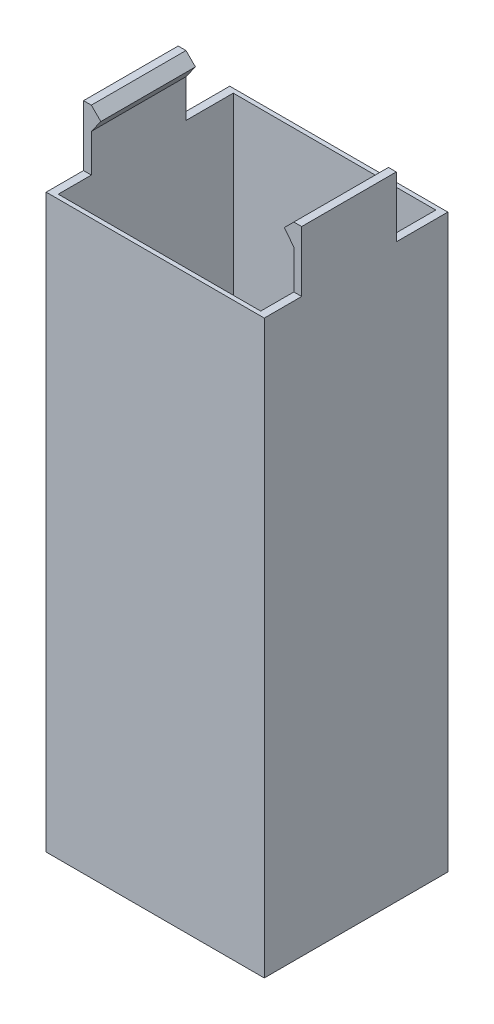
ISO-10303-21;
HEADER;
FILE_DESCRIPTION(('STEP AP214'),'2;1');
FILE_NAME('part.step','',(''),(''),'','','');
FILE_SCHEMA(('AUTOMOTIVE_DESIGN { 1 0 10303 214 1 1 1 1 }'));
ENDSEC;
DATA;
#1=APPLICATION_CONTEXT('core data for automotive mechanical design processes');
#2=APPLICATION_PROTOCOL_DEFINITION('international standard','automotive_design',2000,#1);
#3=PRODUCT_CONTEXT('',#1,'mechanical');
#4=PRODUCT('Part','Part','',(#3));
#5=PRODUCT_RELATED_PRODUCT_CATEGORY('part','',(#4));
#6=PRODUCT_DEFINITION_FORMATION('','',#4);
#7=PRODUCT_DEFINITION_CONTEXT('part definition',#1,'design');
#8=PRODUCT_DEFINITION('design','',#6,#7);
#9=PRODUCT_DEFINITION_SHAPE('','',#8);
#10=(LENGTH_UNIT() NAMED_UNIT(*) SI_UNIT(.MILLI.,.METRE.));
#11=(NAMED_UNIT(*) PLANE_ANGLE_UNIT() SI_UNIT($,.RADIAN.));
#12=(NAMED_UNIT(*) SI_UNIT($,.STERADIAN.) SOLID_ANGLE_UNIT());
#13=UNCERTAINTY_MEASURE_WITH_UNIT(LENGTH_MEASURE(1.E-05),#10,'distance_accuracy_value','');
#14=(GEOMETRIC_REPRESENTATION_CONTEXT(3) GLOBAL_UNCERTAINTY_ASSIGNED_CONTEXT((#13)) GLOBAL_UNIT_ASSIGNED_CONTEXT((#10,
#11,#12)) REPRESENTATION_CONTEXT('',''));
#15=CARTESIAN_POINT('',(0.,0.,0.));
#16=DIRECTION('',(0.,0.,1.));
#17=DIRECTION('',(1.,0.,0.));
#18=AXIS2_PLACEMENT_3D('',#15,#16,#17);
#19=CARTESIAN_POINT('',(0.,120.,0.));
#20=DIRECTION('',(0.,1.,0.));
#21=DIRECTION('',(0.,0.,1.));
#22=AXIS2_PLACEMENT_3D('',#19,#20,#21);
#23=PLANE('',#22);
#24=DIRECTION('',(0.,0.,-1.));
#25=VECTOR('',#24,1.);
#26=CARTESIAN_POINT('',(23.05,120.,-19.4));
#27=LINE('',#26,#25);
#28=CARTESIAN_POINT('',(23.05,120.,19.4));
#29=VERTEX_POINT('',#28);
#30=CARTESIAN_POINT('',(23.05,120.,11.5));
#31=VERTEX_POINT('',#30);
#32=EDGE_CURVE('E183',#29,#31,#27,.T.);
#33=ORIENTED_EDGE('',*,*,#32,.T.);
#34=DIRECTION('',(1.,0.,0.));
#35=VECTOR('',#34,1.);
#36=CARTESIAN_POINT('',(21.4,120.,11.5));
#37=LINE('',#36,#35);
#38=CARTESIAN_POINT('',(21.4,120.,11.5));
#39=VERTEX_POINT('',#38);
#40=EDGE_CURVE('E226',#39,#31,#37,.T.);
#41=ORIENTED_EDGE('',*,*,#40,.F.);
#42=DIRECTION('',(0.,0.,-1.));
#43=VECTOR('',#42,1.);
#44=CARTESIAN_POINT('',(21.4,120.,-18.5));
#45=LINE('',#44,#43);
#46=CARTESIAN_POINT('',(21.4,120.,18.5));
#47=VERTEX_POINT('',#46);
#48=EDGE_CURVE('E289',#47,#39,#45,.T.);
#49=ORIENTED_EDGE('',*,*,#48,.F.);
#50=DIRECTION('',(1.,0.,0.));
#51=VECTOR('',#50,1.);
#52=CARTESIAN_POINT('',(21.4,120.,18.5));
#53=LINE('',#52,#51);
#54=CARTESIAN_POINT('',(-21.4,120.,18.5));
#55=VERTEX_POINT('',#54);
#56=EDGE_CURVE('E285',#55,#47,#53,.T.);
#57=ORIENTED_EDGE('',*,*,#56,.F.);
#58=DIRECTION('',(0.,0.,1.));
#59=VECTOR('',#58,1.);
#60=CARTESIAN_POINT('',(-21.4,120.,-18.5));
#61=LINE('',#60,#59);
#62=CARTESIAN_POINT('',(-21.4,120.,11.5));
#63=VERTEX_POINT('',#62);
#64=EDGE_CURVE('E286',#63,#55,#61,.T.);
#65=ORIENTED_EDGE('',*,*,#64,.F.);
#66=DIRECTION('',(1.,0.,0.));
#67=VECTOR('',#66,1.);
#68=CARTESIAN_POINT('',(-21.4,120.,11.5));
#69=LINE('',#68,#67);
#70=CARTESIAN_POINT('',(-23.05,120.,11.5));
#71=VERTEX_POINT('',#70);
#72=EDGE_CURVE('E256',#71,#63,#69,.T.);
#73=ORIENTED_EDGE('',*,*,#72,.F.);
#74=DIRECTION('',(0.,0.,1.));
#75=VECTOR('',#74,1.);
#76=CARTESIAN_POINT('',(-23.05,120.,-19.4));
#77=LINE('',#76,#75);
#78=CARTESIAN_POINT('',(-23.05,120.,19.4));
#79=VERTEX_POINT('',#78);
#80=EDGE_CURVE('E318',#71,#79,#77,.T.);
#81=ORIENTED_EDGE('',*,*,#80,.T.);
#82=DIRECTION('',(1.,0.,0.));
#83=VECTOR('',#82,1.);
#84=CARTESIAN_POINT('',(-23.05,120.,19.4));
#85=LINE('',#84,#83);
#86=EDGE_CURVE('E187',#79,#29,#85,.T.);
#87=ORIENTED_EDGE('',*,*,#86,.T.);
#88=EDGE_LOOP('',(#33,#41,#49,#57,#65,#73,#81,#87));
#89=FACE_BOUND('',#88,.T.);
#90=ADVANCED_FACE('F37',(#89),#23,.T.);
#91=CARTESIAN_POINT('',(21.4,120.,-8.5));
#92=VERTEX_POINT('',#91);
#93=CARTESIAN_POINT('',(21.4,120.,-18.5));
#94=VERTEX_POINT('',#93);
#95=EDGE_CURVE('E288',#92,#94,#45,.T.);
#96=ORIENTED_EDGE('',*,*,#95,.F.);
#97=DIRECTION('',(-1.,0.,0.));
#98=VECTOR('',#97,1.);
#99=CARTESIAN_POINT('',(21.4,120.,-8.5));
#100=LINE('',#99,#98);
#101=CARTESIAN_POINT('',(23.05,120.,-8.5));
#102=VERTEX_POINT('',#101);
#103=EDGE_CURVE('E240',#102,#92,#100,.T.);
#104=ORIENTED_EDGE('',*,*,#103,.F.);
#105=CARTESIAN_POINT('',(23.05,120.,-19.4));
#106=VERTEX_POINT('',#105);
#107=EDGE_CURVE('E314',#102,#106,#27,.T.);
#108=ORIENTED_EDGE('',*,*,#107,.T.);
#109=DIRECTION('',(-1.,0.,0.));
#110=VECTOR('',#109,1.);
#111=CARTESIAN_POINT('',(-23.05,120.,-19.4));
#112=LINE('',#111,#110);
#113=CARTESIAN_POINT('',(-23.05,120.,-19.4));
#114=VERTEX_POINT('',#113);
#115=EDGE_CURVE('E316',#106,#114,#112,.T.);
#116=ORIENTED_EDGE('',*,*,#115,.T.);
#117=CARTESIAN_POINT('',(-23.05,120.,-8.49999999999999));
#118=VERTEX_POINT('',#117);
#119=EDGE_CURVE('E319',#114,#118,#77,.T.);
#120=ORIENTED_EDGE('',*,*,#119,.T.);
#121=DIRECTION('',(-1.,0.,0.));
#122=VECTOR('',#121,1.);
#123=CARTESIAN_POINT('',(-21.4,120.,-8.49999999999999));
#124=LINE('',#123,#122);
#125=CARTESIAN_POINT('',(-21.4,120.,-8.49999999999999));
#126=VERTEX_POINT('',#125);
#127=EDGE_CURVE('E261',#126,#118,#124,.T.);
#128=ORIENTED_EDGE('',*,*,#127,.F.);
#129=CARTESIAN_POINT('',(-21.4,120.,-18.5));
#130=VERTEX_POINT('',#129);
#131=EDGE_CURVE('E282',#130,#126,#61,.T.);
#132=ORIENTED_EDGE('',*,*,#131,.F.);
#133=DIRECTION('',(-1.,0.,0.));
#134=VECTOR('',#133,1.);
#135=CARTESIAN_POINT('',(21.4,120.,-18.5));
#136=LINE('',#135,#134);
#137=EDGE_CURVE('E292',#94,#130,#136,.T.);
#138=ORIENTED_EDGE('',*,*,#137,.F.);
#139=EDGE_LOOP('',(#96,#104,#108,#116,#120,#128,#132,#138));
#140=FACE_BOUND('',#139,.T.);
#141=ADVANCED_FACE('F336',(#140),#23,.T.);
#142=CARTESIAN_POINT('',(23.05,120.,-19.4));
#143=DIRECTION('',(-1.,0.,0.));
#144=DIRECTION('',(0.,0.,1.));
#145=AXIS2_PLACEMENT_3D('',#142,#143,#144);
#146=PLANE('',#145);
#147=DIRECTION('',(0.,-1.,0.));
#148=VECTOR('',#147,1.);
#149=CARTESIAN_POINT('',(23.05,120.,19.4));
#150=LINE('',#149,#148);
#151=CARTESIAN_POINT('',(23.05,-0.8,19.4));
#152=VERTEX_POINT('',#151);
#153=EDGE_CURVE('E176',#29,#152,#150,.T.);
#154=ORIENTED_EDGE('',*,*,#153,.T.);
#155=DIRECTION('',(0.,0.,1.));
#156=VECTOR('',#155,1.);
#157=CARTESIAN_POINT('',(23.05,-0.8,19.4));
#158=LINE('',#157,#156);
#159=CARTESIAN_POINT('',(23.05,-0.8,-19.4));
#160=VERTEX_POINT('',#159);
#161=EDGE_CURVE('E180',#160,#152,#158,.T.);
#162=ORIENTED_EDGE('',*,*,#161,.F.);
#163=DIRECTION('',(0.,-1.,0.));
#164=VECTOR('',#163,1.);
#165=CARTESIAN_POINT('',(23.05,120.,-19.4));
#166=LINE('',#165,#164);
#167=EDGE_CURVE('E11',#106,#160,#166,.T.);
#168=ORIENTED_EDGE('',*,*,#167,.F.);
#169=ORIENTED_EDGE('',*,*,#107,.F.);
#170=DIRECTION('',(0.,-1.,0.));
#171=VECTOR('',#170,1.);
#172=CARTESIAN_POINT('',(23.05,132.8,-8.5));
#173=LINE('',#172,#171);
#174=CARTESIAN_POINT('',(23.05,132.8,-8.5));
#175=VERTEX_POINT('',#174);
#176=EDGE_CURVE('E250',#175,#102,#173,.T.);
#177=ORIENTED_EDGE('',*,*,#176,.F.);
#178=DIRECTION('',(0.,0.,-1.));
#179=VECTOR('',#178,1.);
#180=CARTESIAN_POINT('',(23.05,132.8,11.5));
#181=LINE('',#180,#179);
#182=CARTESIAN_POINT('',(23.05,132.8,11.5));
#183=VERTEX_POINT('',#182);
#184=EDGE_CURVE('E242',#183,#175,#181,.T.);
#185=ORIENTED_EDGE('',*,*,#184,.F.);
#186=DIRECTION('',(0.,-1.,0.));
#187=VECTOR('',#186,1.);
#188=CARTESIAN_POINT('',(23.05,132.8,11.5));
#189=LINE('',#188,#187);
#190=EDGE_CURVE('E252',#183,#31,#189,.T.);
#191=ORIENTED_EDGE('',*,*,#190,.T.);
#192=ORIENTED_EDGE('',*,*,#32,.F.);
#193=EDGE_LOOP('',(#154,#162,#168,#169,#177,#185,#191,#192));
#194=FACE_BOUND('',#193,.T.);
#195=ADVANCED_FACE('F39',(#194),#146,.F.);
#196=CARTESIAN_POINT('',(-23.05,120.,-19.4));
#197=DIRECTION('',(0.,0.,1.));
#198=DIRECTION('',(1.,0.,0.));
#199=AXIS2_PLACEMENT_3D('',#196,#197,#198);
#200=PLANE('',#199);
#201=ORIENTED_EDGE('',*,*,#167,.T.);
#202=DIRECTION('',(1.,0.,0.));
#203=VECTOR('',#202,1.);
#204=CARTESIAN_POINT('',(23.05,-0.8,-19.4));
#205=LINE('',#204,#203);
#206=CARTESIAN_POINT('',(-23.05,-0.8,-19.4));
#207=VERTEX_POINT('',#206);
#208=EDGE_CURVE('E201',#207,#160,#205,.T.);
#209=ORIENTED_EDGE('',*,*,#208,.F.);
#210=DIRECTION('',(0.,-1.,0.));
#211=VECTOR('',#210,1.);
#212=CARTESIAN_POINT('',(-23.05,120.,-19.4));
#213=LINE('',#212,#211);
#214=EDGE_CURVE('E45',#114,#207,#213,.T.);
#215=ORIENTED_EDGE('',*,*,#214,.F.);
#216=ORIENTED_EDGE('',*,*,#115,.F.);
#217=EDGE_LOOP('',(#201,#209,#215,#216));
#218=FACE_BOUND('',#217,.T.);
#219=ADVANCED_FACE('F328',(#218),#200,.F.);
#220=CARTESIAN_POINT('',(-23.05,120.,-19.4));
#221=DIRECTION('',(1.,0.,0.));
#222=DIRECTION('',(0.,0.,-1.));
#223=AXIS2_PLACEMENT_3D('',#220,#221,#222);
#224=PLANE('',#223);
#225=ORIENTED_EDGE('',*,*,#214,.T.);
#226=DIRECTION('',(0.,0.,-1.));
#227=VECTOR('',#226,1.);
#228=CARTESIAN_POINT('',(-23.05,-0.8,19.4));
#229=LINE('',#228,#227);
#230=CARTESIAN_POINT('',(-23.05,-0.8,19.4));
#231=VERTEX_POINT('',#230);
#232=EDGE_CURVE('E196',#231,#207,#229,.T.);
#233=ORIENTED_EDGE('',*,*,#232,.F.);
#234=DIRECTION('',(0.,-1.,0.));
#235=VECTOR('',#234,1.);
#236=CARTESIAN_POINT('',(-23.05,120.,19.4));
#237=LINE('',#236,#235);
#238=EDGE_CURVE('E186',#79,#231,#237,.T.);
#239=ORIENTED_EDGE('',*,*,#238,.F.);
#240=ORIENTED_EDGE('',*,*,#80,.F.);
#241=DIRECTION('',(0.,-1.,0.));
#242=VECTOR('',#241,1.);
#243=CARTESIAN_POINT('',(-23.05,132.8,11.5));
#244=LINE('',#243,#242);
#245=CARTESIAN_POINT('',(-23.05,132.8,11.5));
#246=VERTEX_POINT('',#245);
#247=EDGE_CURVE('E278',#246,#71,#244,.T.);
#248=ORIENTED_EDGE('',*,*,#247,.F.);
#249=DIRECTION('',(0.,0.,1.));
#250=VECTOR('',#249,1.);
#251=CARTESIAN_POINT('',(-23.05,132.8,11.5));
#252=LINE('',#251,#250);
#253=CARTESIAN_POINT('',(-23.05,132.8,-8.49999999999999));
#254=VERTEX_POINT('',#253);
#255=EDGE_CURVE('E257',#254,#246,#252,.T.);
#256=ORIENTED_EDGE('',*,*,#255,.F.);
#257=DIRECTION('',(0.,-1.,0.));
#258=VECTOR('',#257,1.);
#259=CARTESIAN_POINT('',(-23.05,132.8,-8.49999999999999));
#260=LINE('',#259,#258);
#261=EDGE_CURVE('E269',#254,#118,#260,.T.);
#262=ORIENTED_EDGE('',*,*,#261,.T.);
#263=ORIENTED_EDGE('',*,*,#119,.F.);
#264=EDGE_LOOP('',(#225,#233,#239,#240,#248,#256,#262,#263));
#265=FACE_BOUND('',#264,.T.);
#266=ADVANCED_FACE('F325',(#265),#224,.F.);
#267=CARTESIAN_POINT('',(-23.05,120.,19.4));
#268=DIRECTION('',(0.,0.,-1.));
#269=DIRECTION('',(-1.,0.,0.));
#270=AXIS2_PLACEMENT_3D('',#267,#268,#269);
#271=PLANE('',#270);
#272=ORIENTED_EDGE('',*,*,#238,.T.);
#273=DIRECTION('',(-1.,0.,0.));
#274=VECTOR('',#273,1.);
#275=CARTESIAN_POINT('',(23.05,-0.8,19.4));
#276=LINE('',#275,#274);
#277=EDGE_CURVE('E190',#152,#231,#276,.T.);
#278=ORIENTED_EDGE('',*,*,#277,.F.);
#279=ORIENTED_EDGE('',*,*,#153,.F.);
#280=ORIENTED_EDGE('',*,*,#86,.F.);
#281=EDGE_LOOP('',(#272,#278,#279,#280));
#282=FACE_BOUND('',#281,.T.);
#283=ADVANCED_FACE('F191',(#282),#271,.F.);
#284=CARTESIAN_POINT('',(-21.4,120.,-18.5));
#285=DIRECTION('',(1.,0.,0.));
#286=DIRECTION('',(0.,0.,-1.));
#287=AXIS2_PLACEMENT_3D('',#284,#285,#286);
#288=PLANE('',#287);
#289=DIRECTION('',(0.,0.,1.));
#290=VECTOR('',#289,1.);
#291=CARTESIAN_POINT('',(-21.4,128.,-13.7));
#292=LINE('',#291,#290);
#293=CARTESIAN_POINT('',(-21.4,128.,-8.50000000000005));
#294=VERTEX_POINT('',#293);
#295=CARTESIAN_POINT('',(-21.4,128.,11.5));
#296=VERTEX_POINT('',#295);
#297=EDGE_CURVE('E232',#294,#296,#292,.T.);
#298=ORIENTED_EDGE('',*,*,#297,.T.);
#299=DIRECTION('',(0.,-1.,0.));
#300=VECTOR('',#299,1.);
#301=CARTESIAN_POINT('',(-21.4,132.8,11.5));
#302=LINE('',#301,#300);
#303=EDGE_CURVE('E276',#296,#63,#302,.T.);
#304=ORIENTED_EDGE('',*,*,#303,.T.);
#305=ORIENTED_EDGE('',*,*,#64,.T.);
#306=DIRECTION('',(0.,-1.,0.));
#307=VECTOR('',#306,1.);
#308=CARTESIAN_POINT('',(-21.4,120.,18.5));
#309=LINE('',#308,#307);
#310=CARTESIAN_POINT('',(-21.4,0.,18.5));
#311=VERTEX_POINT('',#310);
#312=EDGE_CURVE('E311',#55,#311,#309,.T.);
#313=ORIENTED_EDGE('',*,*,#312,.T.);
#314=DIRECTION('',(0.,0.,1.));
#315=VECTOR('',#314,1.);
#316=CARTESIAN_POINT('',(-21.4,0.,-18.5));
#317=LINE('',#316,#315);
#318=CARTESIAN_POINT('',(-21.4,0.,-18.5));
#319=VERTEX_POINT('',#318);
#320=EDGE_CURVE('E281',#319,#311,#317,.T.);
#321=ORIENTED_EDGE('',*,*,#320,.F.);
#322=DIRECTION('',(0.,-1.,0.));
#323=VECTOR('',#322,1.);
#324=CARTESIAN_POINT('',(-21.4,120.,-18.5));
#325=LINE('',#324,#323);
#326=EDGE_CURVE('E294',#130,#319,#325,.T.);
#327=ORIENTED_EDGE('',*,*,#326,.F.);
#328=ORIENTED_EDGE('',*,*,#131,.T.);
#329=DIRECTION('',(0.,-1.,0.));
#330=VECTOR('',#329,1.);
#331=CARTESIAN_POINT('',(-21.4,132.8,-8.49999999999999));
#332=LINE('',#331,#330);
#333=EDGE_CURVE('E60',#294,#126,#332,.T.);
#334=ORIENTED_EDGE('',*,*,#333,.F.);
#335=EDGE_LOOP('',(#298,#304,#305,#313,#321,#327,#328,#334));
#336=FACE_BOUND('',#335,.T.);
#337=ADVANCED_FACE('F366',(#336),#288,.T.);
#338=CARTESIAN_POINT('',(21.4,120.,18.5));
#339=DIRECTION('',(0.,0.,-1.));
#340=DIRECTION('',(-1.,0.,0.));
#341=AXIS2_PLACEMENT_3D('',#338,#339,#340);
#342=PLANE('',#341);
#343=DIRECTION('',(1.,0.,0.));
#344=VECTOR('',#343,1.);
#345=CARTESIAN_POINT('',(21.4,0.,18.5));
#346=LINE('',#345,#344);
#347=CARTESIAN_POINT('',(21.4,0.,18.5));
#348=VERTEX_POINT('',#347);
#349=EDGE_CURVE('E297',#311,#348,#346,.T.);
#350=ORIENTED_EDGE('',*,*,#349,.F.);
#351=ORIENTED_EDGE('',*,*,#312,.F.);
#352=ORIENTED_EDGE('',*,*,#56,.T.);
#353=DIRECTION('',(0.,-1.,0.));
#354=VECTOR('',#353,1.);
#355=CARTESIAN_POINT('',(21.4,120.,18.5));
#356=LINE('',#355,#354);
#357=EDGE_CURVE('E309',#47,#348,#356,.T.);
#358=ORIENTED_EDGE('',*,*,#357,.T.);
#359=EDGE_LOOP('',(#350,#351,#352,#358));
#360=FACE_BOUND('',#359,.T.);
#361=ADVANCED_FACE('F379',(#360),#342,.T.);
#362=CARTESIAN_POINT('',(21.4,120.,-18.5));
#363=DIRECTION('',(-1.,0.,0.));
#364=DIRECTION('',(0.,0.,1.));
#365=AXIS2_PLACEMENT_3D('',#362,#363,#364);
#366=PLANE('',#365);
#367=DIRECTION('',(0.,0.,1.));
#368=VECTOR('',#367,1.);
#369=CARTESIAN_POINT('',(21.4,128.2,-13.7));
#370=LINE('',#369,#368);
#371=CARTESIAN_POINT('',(21.4,128.2,-8.5));
#372=VERTEX_POINT('',#371);
#373=CARTESIAN_POINT('',(21.4,128.2,11.5));
#374=VERTEX_POINT('',#373);
#375=EDGE_CURVE('E210',#372,#374,#370,.T.);
#376=ORIENTED_EDGE('',*,*,#375,.F.);
#377=DIRECTION('',(0.,-1.,0.));
#378=VECTOR('',#377,1.);
#379=CARTESIAN_POINT('',(21.4,132.8,-8.5));
#380=LINE('',#379,#378);
#381=EDGE_CURVE('E52',#372,#92,#380,.T.);
#382=ORIENTED_EDGE('',*,*,#381,.T.);
#383=ORIENTED_EDGE('',*,*,#95,.T.);
#384=DIRECTION('',(0.,-1.,0.));
#385=VECTOR('',#384,1.);
#386=CARTESIAN_POINT('',(21.4,120.,-18.5));
#387=LINE('',#386,#385);
#388=CARTESIAN_POINT('',(21.4,0.,-18.5));
#389=VERTEX_POINT('',#388);
#390=EDGE_CURVE('E307',#94,#389,#387,.T.);
#391=ORIENTED_EDGE('',*,*,#390,.T.);
#392=DIRECTION('',(0.,0.,-1.));
#393=VECTOR('',#392,1.);
#394=CARTESIAN_POINT('',(21.4,0.,-18.5));
#395=LINE('',#394,#393);
#396=EDGE_CURVE('E300',#348,#389,#395,.T.);
#397=ORIENTED_EDGE('',*,*,#396,.F.);
#398=ORIENTED_EDGE('',*,*,#357,.F.);
#399=ORIENTED_EDGE('',*,*,#48,.T.);
#400=DIRECTION('',(0.,-1.,0.));
#401=VECTOR('',#400,1.);
#402=CARTESIAN_POINT('',(21.4,132.8,11.5));
#403=LINE('',#402,#401);
#404=EDGE_CURVE('E254',#374,#39,#403,.T.);
#405=ORIENTED_EDGE('',*,*,#404,.F.);
#406=EDGE_LOOP('',(#376,#382,#383,#391,#397,#398,#399,#405));
#407=FACE_BOUND('',#406,.T.);
#408=ADVANCED_FACE('F373',(#407),#366,.T.);
#409=CARTESIAN_POINT('',(21.4,120.,-18.5));
#410=DIRECTION('',(0.,0.,1.));
#411=DIRECTION('',(1.,0.,0.));
#412=AXIS2_PLACEMENT_3D('',#409,#410,#411);
#413=PLANE('',#412);
#414=DIRECTION('',(-1.,0.,0.));
#415=VECTOR('',#414,1.);
#416=CARTESIAN_POINT('',(21.4,0.,-18.5));
#417=LINE('',#416,#415);
#418=EDGE_CURVE('E303',#389,#319,#417,.T.);
#419=ORIENTED_EDGE('',*,*,#418,.F.);
#420=ORIENTED_EDGE('',*,*,#390,.F.);
#421=ORIENTED_EDGE('',*,*,#137,.T.);
#422=ORIENTED_EDGE('',*,*,#326,.T.);
#423=EDGE_LOOP('',(#419,#420,#421,#422));
#424=FACE_BOUND('',#423,.T.);
#425=ADVANCED_FACE('F370',(#424),#413,.T.);
#426=CARTESIAN_POINT('',(-21.4,132.8,11.5));
#427=DIRECTION('',(0.,0.,-1.));
#428=DIRECTION('',(-1.,0.,0.));
#429=AXIS2_PLACEMENT_3D('',#426,#427,#428);
#430=PLANE('',#429);
#431=ORIENTED_EDGE('',*,*,#72,.T.);
#432=ORIENTED_EDGE('',*,*,#303,.F.);
#433=DIRECTION('',(0.581238193719097,0.813733471206735,0.));
#434=VECTOR('',#433,1.);
#435=CARTESIAN_POINT('',(-19.4,130.8,11.5));
#436=LINE('',#435,#434);
#437=CARTESIAN_POINT('',(-19.4,130.8,11.5));
#438=VERTEX_POINT('',#437);
#439=EDGE_CURVE('E229',#296,#438,#436,.T.);
#440=ORIENTED_EDGE('',*,*,#439,.T.);
#441=DIRECTION('',(-0.707106781186547,0.707106781186548,0.));
#442=VECTOR('',#441,1.);
#443=CARTESIAN_POINT('',(-21.4,132.8,11.5));
#444=LINE('',#443,#442);
#445=CARTESIAN_POINT('',(-21.4,132.8,11.5));
#446=VERTEX_POINT('',#445);
#447=EDGE_CURVE('E220',#438,#446,#444,.T.);
#448=ORIENTED_EDGE('',*,*,#447,.T.);
#449=DIRECTION('',(1.,0.,0.));
#450=VECTOR('',#449,1.);
#451=CARTESIAN_POINT('',(-21.4,132.8,11.5));
#452=LINE('',#451,#450);
#453=EDGE_CURVE('E260',#246,#446,#452,.T.);
#454=ORIENTED_EDGE('',*,*,#453,.F.);
#455=ORIENTED_EDGE('',*,*,#247,.T.);
#456=EDGE_LOOP('',(#431,#432,#440,#448,#454,#455));
#457=FACE_BOUND('',#456,.T.);
#458=ADVANCED_FACE('F355',(#457),#430,.F.);
#459=CARTESIAN_POINT('',(-21.4,132.8,-8.49999999999999));
#460=DIRECTION('',(0.,0.,1.));
#461=DIRECTION('',(1.,0.,0.));
#462=AXIS2_PLACEMENT_3D('',#459,#460,#461);
#463=PLANE('',#462);
#464=ORIENTED_EDGE('',*,*,#127,.T.);
#465=ORIENTED_EDGE('',*,*,#261,.F.);
#466=DIRECTION('',(-1.,0.,0.));
#467=VECTOR('',#466,1.);
#468=CARTESIAN_POINT('',(-21.4,132.8,-8.49999999999999));
#469=LINE('',#468,#467);
#470=CARTESIAN_POINT('',(-21.4,132.8,-8.49999999999999));
#471=VERTEX_POINT('',#470);
#472=EDGE_CURVE('E267',#471,#254,#469,.T.);
#473=ORIENTED_EDGE('',*,*,#472,.F.);
#474=DIRECTION('',(0.707106781186547,-0.707106781186548,0.));
#475=VECTOR('',#474,1.);
#476=CARTESIAN_POINT('',(-21.4,132.8,-8.50000000000005));
#477=LINE('',#476,#475);
#478=CARTESIAN_POINT('',(-19.4,130.8,-8.50000000000004));
#479=VERTEX_POINT('',#478);
#480=EDGE_CURVE('E223',#471,#479,#477,.T.);
#481=ORIENTED_EDGE('',*,*,#480,.T.);
#482=DIRECTION('',(-0.581238193719097,-0.813733471206735,0.));
#483=VECTOR('',#482,1.);
#484=CARTESIAN_POINT('',(-19.4,130.8,-8.50000000000004));
#485=LINE('',#484,#483);
#486=EDGE_CURVE('E221',#479,#294,#485,.T.);
#487=ORIENTED_EDGE('',*,*,#486,.T.);
#488=ORIENTED_EDGE('',*,*,#333,.T.);
#489=EDGE_LOOP('',(#464,#465,#473,#481,#487,#488));
#490=FACE_BOUND('',#489,.T.);
#491=ADVANCED_FACE('F362',(#490),#463,.F.);
#492=CARTESIAN_POINT('',(0.,132.8,0.));
#493=DIRECTION('',(0.,1.,0.));
#494=DIRECTION('',(0.,0.,1.));
#495=AXIS2_PLACEMENT_3D('',#492,#493,#494);
#496=PLANE('',#495);
#497=ORIENTED_EDGE('',*,*,#255,.T.);
#498=ORIENTED_EDGE('',*,*,#453,.T.);
#499=DIRECTION('',(0.,0.,-1.));
#500=VECTOR('',#499,1.);
#501=CARTESIAN_POINT('',(-21.4,132.8,11.5));
#502=LINE('',#501,#500);
#503=EDGE_CURVE('E264',#446,#471,#502,.T.);
#504=ORIENTED_EDGE('',*,*,#503,.T.);
#505=ORIENTED_EDGE('',*,*,#472,.T.);
#506=EDGE_LOOP('',(#497,#498,#504,#505));
#507=FACE_BOUND('',#506,.T.);
#508=ADVANCED_FACE('F359',(#507),#496,.T.);
#509=CARTESIAN_POINT('',(21.4,132.8,11.5));
#510=DIRECTION('',(0.,0.,-1.));
#511=DIRECTION('',(-1.,0.,0.));
#512=AXIS2_PLACEMENT_3D('',#509,#510,#511);
#513=PLANE('',#512);
#514=ORIENTED_EDGE('',*,*,#40,.T.);
#515=ORIENTED_EDGE('',*,*,#190,.F.);
#516=DIRECTION('',(1.,0.,0.));
#517=VECTOR('',#516,1.);
#518=CARTESIAN_POINT('',(21.4,132.8,11.5));
#519=LINE('',#518,#517);
#520=CARTESIAN_POINT('',(21.4,132.8,11.5));
#521=VERTEX_POINT('',#520);
#522=EDGE_CURVE('E239',#521,#183,#519,.T.);
#523=ORIENTED_EDGE('',*,*,#522,.F.);
#524=DIRECTION('',(-0.707106781186548,-0.707106781186547,0.));
#525=VECTOR('',#524,1.);
#526=CARTESIAN_POINT('',(21.4,132.8,11.5));
#527=LINE('',#526,#525);
#528=CARTESIAN_POINT('',(19.4,130.8,11.5));
#529=VERTEX_POINT('',#528);
#530=EDGE_CURVE('E206',#521,#529,#527,.T.);
#531=ORIENTED_EDGE('',*,*,#530,.T.);
#532=DIRECTION('',(0.609710760849694,-0.792623989104599,0.));
#533=VECTOR('',#532,1.);
#534=CARTESIAN_POINT('',(19.4,130.8,11.5));
#535=LINE('',#534,#533);
#536=EDGE_CURVE('E213',#529,#374,#535,.T.);
#537=ORIENTED_EDGE('',*,*,#536,.T.);
#538=ORIENTED_EDGE('',*,*,#404,.T.);
#539=EDGE_LOOP('',(#514,#515,#523,#531,#537,#538));
#540=FACE_BOUND('',#539,.T.);
#541=ADVANCED_FACE('F382',(#540),#513,.F.);
#542=CARTESIAN_POINT('',(21.4,132.8,-8.5));
#543=DIRECTION('',(0.,0.,1.));
#544=DIRECTION('',(1.,0.,0.));
#545=AXIS2_PLACEMENT_3D('',#542,#543,#544);
#546=PLANE('',#545);
#547=ORIENTED_EDGE('',*,*,#103,.T.);
#548=ORIENTED_EDGE('',*,*,#381,.F.);
#549=DIRECTION('',(-0.609710760849694,0.792623989104599,0.));
#550=VECTOR('',#549,1.);
#551=CARTESIAN_POINT('',(19.4,130.8,-8.5));
#552=LINE('',#551,#550);
#553=CARTESIAN_POINT('',(19.4,130.8,-8.5));
#554=VERTEX_POINT('',#553);
#555=EDGE_CURVE('E209',#372,#554,#552,.T.);
#556=ORIENTED_EDGE('',*,*,#555,.T.);
#557=DIRECTION('',(0.707106781186548,0.707106781186547,0.));
#558=VECTOR('',#557,1.);
#559=CARTESIAN_POINT('',(21.4,132.8,-8.5));
#560=LINE('',#559,#558);
#561=CARTESIAN_POINT('',(21.4,132.8,-8.5));
#562=VERTEX_POINT('',#561);
#563=EDGE_CURVE('E207',#554,#562,#560,.T.);
#564=ORIENTED_EDGE('',*,*,#563,.T.);
#565=DIRECTION('',(-1.,0.,0.));
#566=VECTOR('',#565,1.);
#567=CARTESIAN_POINT('',(21.4,132.8,-8.5));
#568=LINE('',#567,#566);
#569=EDGE_CURVE('E244',#175,#562,#568,.T.);
#570=ORIENTED_EDGE('',*,*,#569,.F.);
#571=ORIENTED_EDGE('',*,*,#176,.T.);
#572=EDGE_LOOP('',(#547,#548,#556,#564,#570,#571));
#573=FACE_BOUND('',#572,.T.);
#574=ADVANCED_FACE('F339',(#573),#546,.F.);
#575=CARTESIAN_POINT('',(0.,132.8,0.));
#576=DIRECTION('',(0.,-1.,0.));
#577=DIRECTION('',(0.,0.,-1.));
#578=AXIS2_PLACEMENT_3D('',#575,#576,#577);
#579=PLANE('',#578);
#580=DIRECTION('',(0.,0.,1.));
#581=VECTOR('',#580,1.);
#582=CARTESIAN_POINT('',(21.4,132.8,11.5));
#583=LINE('',#582,#581);
#584=EDGE_CURVE('E236',#562,#521,#583,.T.);
#585=ORIENTED_EDGE('',*,*,#584,.T.);
#586=ORIENTED_EDGE('',*,*,#522,.T.);
#587=ORIENTED_EDGE('',*,*,#184,.T.);
#588=ORIENTED_EDGE('',*,*,#569,.T.);
#589=EDGE_LOOP('',(#585,#586,#587,#588));
#590=FACE_BOUND('',#589,.T.);
#591=ADVANCED_FACE('F343',(#590),#579,.F.);
#592=CARTESIAN_POINT('',(-21.4,132.8,-13.7));
#593=DIRECTION('',(0.707106781186548,0.707106781186547,0.));
#594=DIRECTION('',(-0.707106781186547,0.707106781186548,0.));
#595=AXIS2_PLACEMENT_3D('',#592,#593,#594);
#596=PLANE('',#595);
#597=ORIENTED_EDGE('',*,*,#480,.F.);
#598=ORIENTED_EDGE('',*,*,#503,.F.);
#599=ORIENTED_EDGE('',*,*,#447,.F.);
#600=DIRECTION('',(0.,0.,1.));
#601=VECTOR('',#600,1.);
#602=CARTESIAN_POINT('',(-19.4,130.8,-13.7));
#603=LINE('',#602,#601);
#604=EDGE_CURVE('E224',#479,#438,#603,.T.);
#605=ORIENTED_EDGE('',*,*,#604,.F.);
#606=EDGE_LOOP('',(#597,#598,#599,#605));
#607=FACE_BOUND('',#606,.T.);
#608=ADVANCED_FACE('F397',(#607),#596,.T.);
#609=CARTESIAN_POINT('',(-19.4,130.8,-13.7));
#610=DIRECTION('',(0.813733471206735,-0.581238193719097,0.));
#611=DIRECTION('',(0.581238193719097,0.813733471206735,0.));
#612=AXIS2_PLACEMENT_3D('',#609,#610,#611);
#613=PLANE('',#612);
#614=ORIENTED_EDGE('',*,*,#486,.F.);
#615=ORIENTED_EDGE('',*,*,#604,.T.);
#616=ORIENTED_EDGE('',*,*,#439,.F.);
#617=ORIENTED_EDGE('',*,*,#297,.F.);
#618=EDGE_LOOP('',(#614,#615,#616,#617));
#619=FACE_BOUND('',#618,.T.);
#620=ADVANCED_FACE('F390',(#619),#613,.T.);
#621=CARTESIAN_POINT('',(21.4,132.8,-13.7));
#622=DIRECTION('',(-0.707106781186547,0.707106781186548,0.));
#623=DIRECTION('',(-0.707106781186548,-0.707106781186547,0.));
#624=AXIS2_PLACEMENT_3D('',#621,#622,#623);
#625=PLANE('',#624);
#626=ORIENTED_EDGE('',*,*,#563,.F.);
#627=DIRECTION('',(0.,0.,1.));
#628=VECTOR('',#627,1.);
#629=CARTESIAN_POINT('',(19.4,130.8,-13.7));
#630=LINE('',#629,#628);
#631=EDGE_CURVE('E216',#554,#529,#630,.T.);
#632=ORIENTED_EDGE('',*,*,#631,.T.);
#633=ORIENTED_EDGE('',*,*,#530,.F.);
#634=ORIENTED_EDGE('',*,*,#584,.F.);
#635=EDGE_LOOP('',(#626,#632,#633,#634));
#636=FACE_BOUND('',#635,.T.);
#637=ADVANCED_FACE('F388',(#636),#625,.T.);
#638=CARTESIAN_POINT('',(19.4,130.8,-13.7));
#639=DIRECTION('',(-0.792623989104599,-0.609710760849694,0.));
#640=DIRECTION('',(0.609710760849694,-0.792623989104599,0.));
#641=AXIS2_PLACEMENT_3D('',#638,#639,#640);
#642=PLANE('',#641);
#643=ORIENTED_EDGE('',*,*,#555,.F.);
#644=ORIENTED_EDGE('',*,*,#375,.T.);
#645=ORIENTED_EDGE('',*,*,#536,.F.);
#646=ORIENTED_EDGE('',*,*,#631,.F.);
#647=EDGE_LOOP('',(#643,#644,#645,#646));
#648=FACE_BOUND('',#647,.T.);
#649=ADVANCED_FACE('F386',(#648),#642,.T.);
#650=CARTESIAN_POINT('',(0.,0.,0.));
#651=DIRECTION('',(0.,1.,0.));
#652=DIRECTION('',(0.,0.,1.));
#653=AXIS2_PLACEMENT_3D('',#650,#651,#652);
#654=PLANE('',#653);
#655=ORIENTED_EDGE('',*,*,#418,.T.);
#656=ORIENTED_EDGE('',*,*,#320,.T.);
#657=ORIENTED_EDGE('',*,*,#349,.T.);
#658=ORIENTED_EDGE('',*,*,#396,.T.);
#659=EDGE_LOOP('',(#655,#656,#657,#658));
#660=FACE_BOUND('',#659,.T.);
#661=ADVANCED_FACE('F376',(#660),#654,.T.);
#662=CARTESIAN_POINT('',(0.,-0.8,0.));
#663=DIRECTION('',(0.,1.,0.));
#664=DIRECTION('',(0.,0.,1.));
#665=AXIS2_PLACEMENT_3D('',#662,#663,#664);
#666=PLANE('',#665);
#667=ORIENTED_EDGE('',*,*,#161,.T.);
#668=ORIENTED_EDGE('',*,*,#277,.T.);
#669=ORIENTED_EDGE('',*,*,#232,.T.);
#670=ORIENTED_EDGE('',*,*,#208,.T.);
#671=EDGE_LOOP('',(#667,#668,#669,#670));
#672=FACE_BOUND('',#671,.T.);
#673=ADVANCED_FACE('F199',(#672),#666,.F.);
#674=CLOSED_SHELL('',(#90,#141,#195,#219,#266,#283,#337,#361,#408,#425,#458,#491,#508,#541,#574,
#591,#608,#620,#637,#649,#661,#673));
#675=MANIFOLD_SOLID_BREP('B2',#674);
#676=ADVANCED_BREP_SHAPE_REPRESENTATION('',(#18,#675),#14);
#677=SHAPE_DEFINITION_REPRESENTATION(#9,#676);
ENDSEC;
END-ISO-10303-21;
